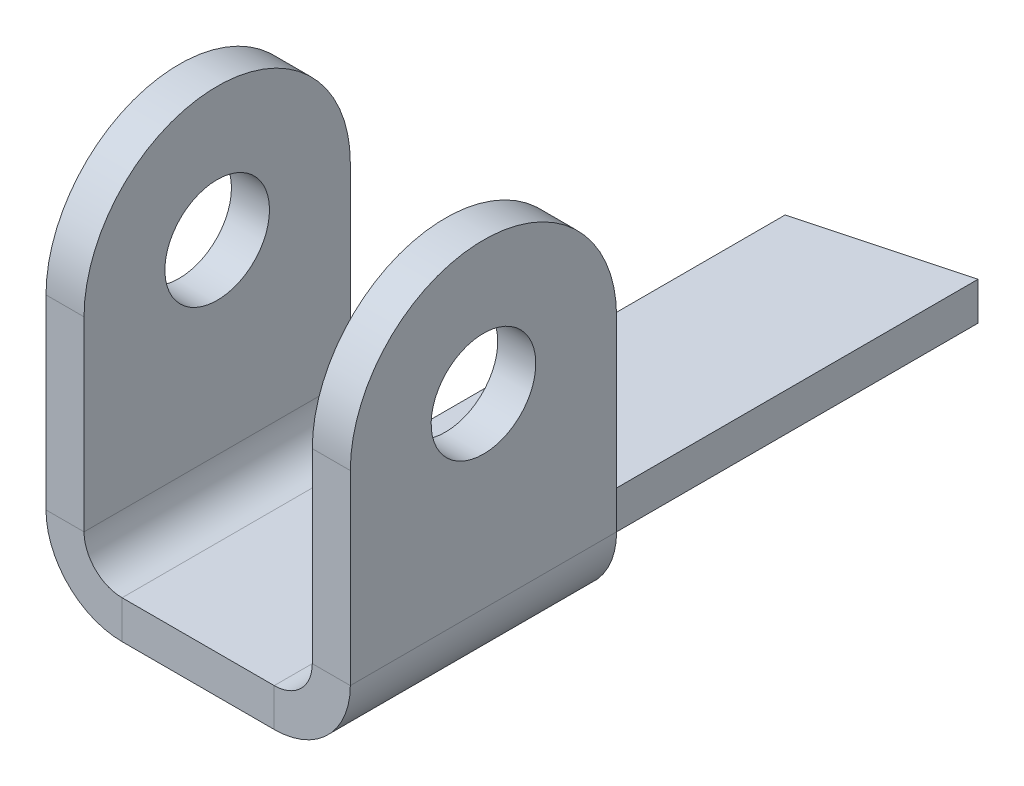
ISO-10303-21;
HEADER;
FILE_DESCRIPTION(('STEP AP214'),'2;1');
FILE_NAME('part.step','',(''),(''),'','','');
FILE_SCHEMA(('AUTOMOTIVE_DESIGN { 1 0 10303 214 1 1 1 1 }'));
ENDSEC;
DATA;
#1=APPLICATION_CONTEXT('core data for automotive mechanical design processes');
#2=APPLICATION_PROTOCOL_DEFINITION('international standard','automotive_design',2000,#1);
#3=PRODUCT_CONTEXT('',#1,'mechanical');
#4=PRODUCT('Part','Part','',(#3));
#5=PRODUCT_RELATED_PRODUCT_CATEGORY('part','',(#4));
#6=PRODUCT_DEFINITION_FORMATION('','',#4);
#7=PRODUCT_DEFINITION_CONTEXT('part definition',#1,'design');
#8=PRODUCT_DEFINITION('design','',#6,#7);
#9=PRODUCT_DEFINITION_SHAPE('','',#8);
#10=(LENGTH_UNIT() NAMED_UNIT(*) SI_UNIT(.MILLI.,.METRE.));
#11=(NAMED_UNIT(*) PLANE_ANGLE_UNIT() SI_UNIT($,.RADIAN.));
#12=(NAMED_UNIT(*) SI_UNIT($,.STERADIAN.) SOLID_ANGLE_UNIT());
#13=UNCERTAINTY_MEASURE_WITH_UNIT(LENGTH_MEASURE(1.E-05),#10,'distance_accuracy_value','');
#14=(GEOMETRIC_REPRESENTATION_CONTEXT(3) GLOBAL_UNCERTAINTY_ASSIGNED_CONTEXT((#13)) GLOBAL_UNIT_ASSIGNED_CONTEXT((#10,
#11,#12)) REPRESENTATION_CONTEXT('',''));
#15=CARTESIAN_POINT('',(0.,0.,0.));
#16=DIRECTION('',(0.,0.,1.));
#17=DIRECTION('',(1.,0.,0.));
#18=AXIS2_PLACEMENT_3D('',#15,#16,#17);
#19=CARTESIAN_POINT('',(-3.99999999999995,-2.,-18.5));
#20=DIRECTION('',(-1.,0.,0.));
#21=DIRECTION('',(0.,0.,-1.));
#22=AXIS2_PLACEMENT_3D('',#19,#20,#21);
#23=PLANE('',#22);
#24=DIRECTION('',(0.,0.,-1.));
#25=VECTOR('',#24,1.);
#26=CARTESIAN_POINT('',(-3.99999999999995,-2.,-18.5));
#27=LINE('',#26,#25);
#28=CARTESIAN_POINT('',(-4.,-2.,4.5));
#29=VERTEX_POINT('',#28);
#30=CARTESIAN_POINT('',(-4.,-2.,-16.3564064605511));
#31=VERTEX_POINT('',#30);
#32=EDGE_CURVE('E203',#29,#31,#27,.T.);
#33=ORIENTED_EDGE('',*,*,#32,.F.);
#34=DIRECTION('',(0.,-1.,0.));
#35=VECTOR('',#34,1.);
#36=CARTESIAN_POINT('',(-4.,0.,4.5));
#37=LINE('',#36,#35);
#38=CARTESIAN_POINT('',(-4.,0.,4.5));
#39=VERTEX_POINT('',#38);
#40=EDGE_CURVE('E177',#39,#29,#37,.T.);
#41=ORIENTED_EDGE('',*,*,#40,.F.);
#42=DIRECTION('',(0.,0.,-1.));
#43=VECTOR('',#42,1.);
#44=CARTESIAN_POINT('',(-3.99999999999995,0.,-18.5));
#45=LINE('',#44,#43);
#46=CARTESIAN_POINT('',(-4.,0.,-16.3564064605511));
#47=VERTEX_POINT('',#46);
#48=EDGE_CURVE('E159',#39,#47,#45,.T.);
#49=ORIENTED_EDGE('',*,*,#48,.T.);
#50=DIRECTION('',(0.,-1.,0.));
#51=VECTOR('',#50,1.);
#52=CARTESIAN_POINT('',(-4.,-2.,-16.3564064605511));
#53=LINE('',#52,#51);
#54=EDGE_CURVE('E165',#31,#47,#53,.F.);
#55=ORIENTED_EDGE('',*,*,#54,.F.);
#56=EDGE_LOOP('',(#33,#41,#49,#55));
#57=FACE_BOUND('',#56,.T.);
#58=ADVANCED_FACE('F47',(#57),#23,.T.);
#59=CARTESIAN_POINT('',(0.,-2.,0.));
#60=DIRECTION('',(0.,-1.,0.));
#61=DIRECTION('',(0.,0.,1.));
#62=AXIS2_PLACEMENT_3D('',#59,#60,#61);
#63=PLANE('',#62);
#64=DIRECTION('',(0.,0.,1.));
#65=VECTOR('',#64,1.);
#66=CARTESIAN_POINT('',(4.,-2.,-18.5));
#67=LINE('',#66,#65);
#68=CARTESIAN_POINT('',(4.,-2.,-18.5));
#69=VERTEX_POINT('',#68);
#70=CARTESIAN_POINT('',(4.00000000000003,-2.,4.50000000000003));
#71=VERTEX_POINT('',#70);
#72=EDGE_CURVE('E182',#69,#71,#67,.T.);
#73=ORIENTED_EDGE('',*,*,#72,.T.);
#74=DIRECTION('',(0.,0.,1.));
#75=VECTOR('',#74,1.);
#76=CARTESIAN_POINT('',(4.00000000000002,-2.,18.5));
#77=LINE('',#76,#75);
#78=CARTESIAN_POINT('',(4.00000000000002,-2.,18.5));
#79=VERTEX_POINT('',#78);
#80=EDGE_CURVE('E297',#79,#71,#77,.F.);
#81=ORIENTED_EDGE('',*,*,#80,.F.);
#82=DIRECTION('',(-1.,0.,0.));
#83=VECTOR('',#82,1.);
#84=CARTESIAN_POINT('',(-3.99999999999998,-2.,18.5));
#85=LINE('',#84,#83);
#86=CARTESIAN_POINT('',(-3.99999999999998,-2.,18.5));
#87=VERTEX_POINT('',#86);
#88=EDGE_CURVE('E207',#79,#87,#85,.T.);
#89=ORIENTED_EDGE('',*,*,#88,.T.);
#90=EDGE_CURVE('E199',#87,#29,#27,.T.);
#91=ORIENTED_EDGE('',*,*,#90,.T.);
#92=ORIENTED_EDGE('',*,*,#32,.T.);
#93=DIRECTION('',(-0.96592582628907,0.,0.258819045102514));
#94=VECTOR('',#93,1.);
#95=CARTESIAN_POINT('',(-4.35705080756876,-2.,-16.2607349850061));
#96=LINE('',#95,#94);
#97=EDGE_CURVE('E166',#69,#31,#96,.T.);
#98=ORIENTED_EDGE('',*,*,#97,.F.);
#99=EDGE_LOOP('',(#73,#81,#89,#91,#92,#98));
#100=FACE_BOUND('',#99,.T.);
#101=ADVANCED_FACE('F286',(#100),#63,.T.);
#102=CARTESIAN_POINT('',(0.,0.,0.));
#103=DIRECTION('',(0.,-1.,0.));
#104=DIRECTION('',(0.,0.,1.));
#105=AXIS2_PLACEMENT_3D('',#102,#103,#104);
#106=PLANE('',#105);
#107=DIRECTION('',(-0.96592582628907,0.,0.258819045102514));
#108=VECTOR('',#107,1.);
#109=CARTESIAN_POINT('',(-4.35705080756876,0.,-16.2607349850061));
#110=LINE('',#109,#108);
#111=CARTESIAN_POINT('',(4.,0.,-18.5));
#112=VERTEX_POINT('',#111);
#113=EDGE_CURVE('E154',#112,#47,#110,.T.);
#114=ORIENTED_EDGE('',*,*,#113,.T.);
#115=ORIENTED_EDGE('',*,*,#48,.F.);
#116=CARTESIAN_POINT('',(-3.99999999999998,0.,18.5));
#117=VERTEX_POINT('',#116);
#118=EDGE_CURVE('E178',#117,#39,#45,.T.);
#119=ORIENTED_EDGE('',*,*,#118,.F.);
#120=DIRECTION('',(-1.,0.,0.));
#121=VECTOR('',#120,1.);
#122=CARTESIAN_POINT('',(-3.99999999999998,0.,18.5));
#123=LINE('',#122,#121);
#124=CARTESIAN_POINT('',(4.00000000000002,0.,18.5));
#125=VERTEX_POINT('',#124);
#126=EDGE_CURVE('E179',#125,#117,#123,.T.);
#127=ORIENTED_EDGE('',*,*,#126,.F.);
#128=DIRECTION('',(0.,0.,1.));
#129=VECTOR('',#128,1.);
#130=CARTESIAN_POINT('',(4.00000000000002,0.,18.5));
#131=LINE('',#130,#129);
#132=CARTESIAN_POINT('',(4.00000000000003,0.,4.50000000000003));
#133=VERTEX_POINT('',#132);
#134=EDGE_CURVE('E310',#125,#133,#131,.F.);
#135=ORIENTED_EDGE('',*,*,#134,.T.);
#136=DIRECTION('',(0.,0.,1.));
#137=VECTOR('',#136,1.);
#138=CARTESIAN_POINT('',(4.,0.,-18.5));
#139=LINE('',#138,#137);
#140=EDGE_CURVE('E163',#112,#133,#139,.T.);
#141=ORIENTED_EDGE('',*,*,#140,.F.);
#142=EDGE_LOOP('',(#114,#115,#119,#127,#135,#141));
#143=FACE_BOUND('',#142,.T.);
#144=ADVANCED_FACE('F156',(#143),#106,.F.);
#145=CARTESIAN_POINT('',(4.,-2.,-18.5));
#146=DIRECTION('',(1.,0.,0.));
#147=DIRECTION('',(0.,0.,1.));
#148=AXIS2_PLACEMENT_3D('',#145,#146,#147);
#149=PLANE('',#148);
#150=DIRECTION('',(0.,-1.,0.));
#151=VECTOR('',#150,1.);
#152=CARTESIAN_POINT('',(4.00000000000003,0.,4.50000000000003));
#153=LINE('',#152,#151);
#154=EDGE_CURVE('E223',#133,#71,#153,.T.);
#155=ORIENTED_EDGE('',*,*,#154,.T.);
#156=ORIENTED_EDGE('',*,*,#72,.F.);
#157=DIRECTION('',(0.,1.,0.));
#158=VECTOR('',#157,1.);
#159=CARTESIAN_POINT('',(4.,-2.,-18.5));
#160=LINE('',#159,#158);
#161=EDGE_CURVE('E13',#69,#112,#160,.T.);
#162=ORIENTED_EDGE('',*,*,#161,.T.);
#163=ORIENTED_EDGE('',*,*,#140,.T.);
#164=EDGE_LOOP('',(#155,#156,#162,#163));
#165=FACE_BOUND('',#164,.T.);
#166=ADVANCED_FACE('F49',(#165),#149,.T.);
#167=CARTESIAN_POINT('',(-3.99999999999998,-2.,18.5));
#168=DIRECTION('',(0.,0.,1.));
#169=DIRECTION('',(-1.,0.,0.));
#170=AXIS2_PLACEMENT_3D('',#167,#168,#169);
#171=PLANE('',#170);
#172=ORIENTED_EDGE('',*,*,#126,.T.);
#173=DIRECTION('',(0.,1.,0.));
#174=VECTOR('',#173,1.);
#175=CARTESIAN_POINT('',(-3.99999999999998,-2.,18.5));
#176=LINE('',#175,#174);
#177=EDGE_CURVE('E56',#87,#117,#176,.T.);
#178=ORIENTED_EDGE('',*,*,#177,.F.);
#179=ORIENTED_EDGE('',*,*,#88,.F.);
#180=DIRECTION('',(0.,1.,0.));
#181=VECTOR('',#180,1.);
#182=CARTESIAN_POINT('',(4.00000000000002,-2.,18.5));
#183=LINE('',#182,#181);
#184=EDGE_CURVE('E188',#79,#125,#183,.T.);
#185=ORIENTED_EDGE('',*,*,#184,.T.);
#186=EDGE_LOOP('',(#172,#178,#179,#185));
#187=FACE_BOUND('',#186,.T.);
#188=ADVANCED_FACE('F367',(#187),#171,.T.);
#189=CARTESIAN_POINT('',(-3.99999999999998,2.,18.5));
#190=DIRECTION('',(0.,0.,1.));
#191=DIRECTION('',(-1.,0.,0.));
#192=AXIS2_PLACEMENT_3D('',#189,#190,#191);
#193=PLANE('',#192);
#194=DIRECTION('',(1.,0.,0.));
#195=VECTOR('',#194,1.);
#196=CARTESIAN_POINT('',(-7.99999999999998,1.99999999999997,18.5));
#197=LINE('',#196,#195);
#198=CARTESIAN_POINT('',(-5.99999999999998,2.,18.5));
#199=VERTEX_POINT('',#198);
#200=CARTESIAN_POINT('',(-7.99999999999998,1.99999999999997,18.5));
#201=VERTEX_POINT('',#200);
#202=EDGE_CURVE('E271',#199,#201,#197,.F.);
#203=ORIENTED_EDGE('',*,*,#202,.T.);
#204=CARTESIAN_POINT('',(-3.99999999999998,2.,18.5));
#205=DIRECTION('',(0.,0.,1.));
#206=DIRECTION('',(1.,0.,0.));
#207=AXIS2_PLACEMENT_3D('',#204,#205,#206);
#208=CIRCLE('',#207,4.);
#209=EDGE_CURVE('E233',#87,#201,#208,.F.);
#210=ORIENTED_EDGE('',*,*,#209,.F.);
#211=ORIENTED_EDGE('',*,*,#177,.T.);
#212=CARTESIAN_POINT('',(-3.99999999999998,2.,18.5));
#213=DIRECTION('',(0.,0.,1.));
#214=DIRECTION('',(1.,0.,0.));
#215=AXIS2_PLACEMENT_3D('',#212,#213,#214);
#216=CIRCLE('',#215,2.);
#217=EDGE_CURVE('E230',#117,#199,#216,.F.);
#218=ORIENTED_EDGE('',*,*,#217,.T.);
#219=EDGE_LOOP('',(#203,#210,#211,#218));
#220=FACE_BOUND('',#219,.T.);
#221=ADVANCED_FACE('F276',(#220),#193,.T.);
#222=CARTESIAN_POINT('',(-4.,2.,4.5));
#223=DIRECTION('',(0.,0.,1.));
#224=DIRECTION('',(-1.,0.,0.));
#225=AXIS2_PLACEMENT_3D('',#222,#223,#224);
#226=PLANE('',#225);
#227=CARTESIAN_POINT('',(-4.,2.,4.5));
#228=DIRECTION('',(0.,0.,1.));
#229=DIRECTION('',(1.,0.,0.));
#230=AXIS2_PLACEMENT_3D('',#227,#228,#229);
#231=CIRCLE('',#230,2.);
#232=CARTESIAN_POINT('',(-5.99999999999996,2.,4.50000000000003));
#233=VERTEX_POINT('',#232);
#234=EDGE_CURVE('E235',#233,#39,#231,.T.);
#235=ORIENTED_EDGE('',*,*,#234,.T.);
#236=ORIENTED_EDGE('',*,*,#40,.T.);
#237=CARTESIAN_POINT('',(-4.,2.,4.5));
#238=DIRECTION('',(0.,0.,1.));
#239=DIRECTION('',(1.,0.,0.));
#240=AXIS2_PLACEMENT_3D('',#237,#238,#239);
#241=CIRCLE('',#240,4.);
#242=CARTESIAN_POINT('',(-7.99999999999997,1.99999999999997,4.5));
#243=VERTEX_POINT('',#242);
#244=EDGE_CURVE('E72',#243,#29,#241,.T.);
#245=ORIENTED_EDGE('',*,*,#244,.F.);
#246=DIRECTION('',(1.,0.,0.));
#247=VECTOR('',#246,1.);
#248=CARTESIAN_POINT('',(-5.99999999999996,2.,4.50000000000003));
#249=LINE('',#248,#247);
#250=EDGE_CURVE('E265',#233,#243,#249,.F.);
#251=ORIENTED_EDGE('',*,*,#250,.F.);
#252=EDGE_LOOP('',(#235,#236,#245,#251));
#253=FACE_BOUND('',#252,.T.);
#254=ADVANCED_FACE('F285',(#253),#226,.F.);
#255=CARTESIAN_POINT('',(-4.,2.,4.5));
#256=DIRECTION('',(0.,0.,-1.));
#257=DIRECTION('',(-1.,0.,0.));
#258=AXIS2_PLACEMENT_3D('',#255,#256,#257);
#259=CYLINDRICAL_SURFACE('',#258,4.);
#260=ORIENTED_EDGE('',*,*,#90,.F.);
#261=ORIENTED_EDGE('',*,*,#209,.T.);
#262=DIRECTION('',(0.,0.,-1.));
#263=VECTOR('',#262,1.);
#264=CARTESIAN_POINT('',(-7.99999999999998,1.99999999999997,18.5));
#265=LINE('',#264,#263);
#266=EDGE_CURVE('E262',#243,#201,#265,.F.);
#267=ORIENTED_EDGE('',*,*,#266,.F.);
#268=ORIENTED_EDGE('',*,*,#244,.T.);
#269=EDGE_LOOP('',(#260,#261,#267,#268));
#270=FACE_BOUND('',#269,.T.);
#271=ADVANCED_FACE('F274',(#270),#259,.T.);
#272=CARTESIAN_POINT('',(-4.,2.,4.5));
#273=DIRECTION('',(0.,0.,-1.));
#274=DIRECTION('',(-1.,0.,0.));
#275=AXIS2_PLACEMENT_3D('',#272,#273,#274);
#276=CYLINDRICAL_SURFACE('',#275,2.);
#277=ORIENTED_EDGE('',*,*,#118,.T.);
#278=ORIENTED_EDGE('',*,*,#234,.F.);
#279=DIRECTION('',(0.,0.,-1.));
#280=VECTOR('',#279,1.);
#281=CARTESIAN_POINT('',(-5.99999999999998,2.,18.5));
#282=LINE('',#281,#280);
#283=EDGE_CURVE('E268',#199,#233,#282,.T.);
#284=ORIENTED_EDGE('',*,*,#283,.F.);
#285=ORIENTED_EDGE('',*,*,#217,.F.);
#286=EDGE_LOOP('',(#277,#278,#284,#285));
#287=FACE_BOUND('',#286,.T.);
#288=ADVANCED_FACE('F370',(#287),#276,.F.);
#289=CARTESIAN_POINT('',(-8.00000000000002,11.79,4.50000000000003));
#290=DIRECTION('',(0.,0.,1.));
#291=DIRECTION('',(0.,1.,0.));
#292=AXIS2_PLACEMENT_3D('',#289,#290,#291);
#293=PLANE('',#292);
#294=ORIENTED_EDGE('',*,*,#250,.T.);
#295=DIRECTION('',(0.,1.,0.));
#296=VECTOR('',#295,1.);
#297=CARTESIAN_POINT('',(-8.00000000000002,11.79,4.50000000000003));
#298=LINE('',#297,#296);
#299=CARTESIAN_POINT('',(-8.00000000000002,11.79,4.50000000000003));
#300=VERTEX_POINT('',#299);
#301=EDGE_CURVE('E253',#243,#300,#298,.T.);
#302=ORIENTED_EDGE('',*,*,#301,.T.);
#303=DIRECTION('',(1.,0.,0.));
#304=VECTOR('',#303,1.);
#305=CARTESIAN_POINT('',(-8.00000000000002,11.79,4.50000000000003));
#306=LINE('',#305,#304);
#307=CARTESIAN_POINT('',(-6.00000000000001,11.79,4.50000000000003));
#308=VERTEX_POINT('',#307);
#309=EDGE_CURVE('E236',#300,#308,#306,.T.);
#310=ORIENTED_EDGE('',*,*,#309,.T.);
#311=DIRECTION('',(0.,-1.,0.));
#312=VECTOR('',#311,1.);
#313=CARTESIAN_POINT('',(-6.00000000000001,11.79,4.50000000000003));
#314=LINE('',#313,#312);
#315=EDGE_CURVE('E259',#233,#308,#314,.F.);
#316=ORIENTED_EDGE('',*,*,#315,.F.);
#317=EDGE_LOOP('',(#294,#302,#310,#316));
#318=FACE_BOUND('',#317,.T.);
#319=ADVANCED_FACE('F284',(#318),#293,.F.);
#320=CARTESIAN_POINT('',(-7.99999999999998,0.,18.5));
#321=DIRECTION('',(0.,0.,-1.));
#322=DIRECTION('',(1.,0.,0.));
#323=AXIS2_PLACEMENT_3D('',#320,#321,#322);
#324=PLANE('',#323);
#325=ORIENTED_EDGE('',*,*,#202,.F.);
#326=DIRECTION('',(0.,1.,0.));
#327=VECTOR('',#326,1.);
#328=CARTESIAN_POINT('',(-5.99999999999996,0.,18.5));
#329=LINE('',#328,#327);
#330=CARTESIAN_POINT('',(-5.99999999999999,11.79,18.5));
#331=VERTEX_POINT('',#330);
#332=EDGE_CURVE('E255',#331,#199,#329,.F.);
#333=ORIENTED_EDGE('',*,*,#332,.F.);
#334=DIRECTION('',(1.,0.,0.));
#335=VECTOR('',#334,1.);
#336=CARTESIAN_POINT('',(-7.99999999999999,11.79,18.5));
#337=LINE('',#336,#335);
#338=CARTESIAN_POINT('',(-7.99999999999999,11.79,18.5));
#339=VERTEX_POINT('',#338);
#340=EDGE_CURVE('E241',#339,#331,#337,.T.);
#341=ORIENTED_EDGE('',*,*,#340,.F.);
#342=DIRECTION('',(0.,-1.,0.));
#343=VECTOR('',#342,1.);
#344=CARTESIAN_POINT('',(-7.99999999999999,11.79,18.5));
#345=LINE('',#344,#343);
#346=EDGE_CURVE('E247',#339,#201,#345,.T.);
#347=ORIENTED_EDGE('',*,*,#346,.T.);
#348=EDGE_LOOP('',(#325,#333,#341,#347));
#349=FACE_BOUND('',#348,.T.);
#350=ADVANCED_FACE('F279',(#349),#324,.F.);
#351=CARTESIAN_POINT('',(-7.99999999999999,11.79,11.5));
#352=DIRECTION('',(1.,0.,0.));
#353=DIRECTION('',(0.,1.,0.));
#354=AXIS2_PLACEMENT_3D('',#351,#352,#353);
#355=PLANE('',#354);
#356=CARTESIAN_POINT('',(-7.99999999999999,11.79,11.5));
#357=DIRECTION('',(1.,0.,0.));
#358=DIRECTION('',(0.,0.,-1.));
#359=AXIS2_PLACEMENT_3D('',#356,#357,#358);
#360=CIRCLE('',#359,2.74999999999999);
#361=CARTESIAN_POINT('',(-7.99999999999999,11.79,8.75000000000005));
#362=VERTEX_POINT('',#361);
#363=EDGE_CURVE('E174',#362,#362,#360,.T.);
#364=ORIENTED_EDGE('',*,*,#363,.T.);
#365=EDGE_LOOP('',(#364));
#366=FACE_BOUND('',#365,.T.);
#367=ORIENTED_EDGE('',*,*,#266,.T.);
#368=ORIENTED_EDGE('',*,*,#346,.F.);
#369=CARTESIAN_POINT('',(-7.99999999999999,11.79,11.5));
#370=DIRECTION('',(-1.,0.,0.));
#371=DIRECTION('',(0.,1.,0.));
#372=AXIS2_PLACEMENT_3D('',#369,#370,#371);
#373=CIRCLE('',#372,7.);
#374=EDGE_CURVE('E251',#300,#339,#373,.F.);
#375=ORIENTED_EDGE('',*,*,#374,.F.);
#376=ORIENTED_EDGE('',*,*,#301,.F.);
#377=EDGE_LOOP('',(#367,#368,#375,#376));
#378=FACE_BOUND('',#377,.T.);
#379=ADVANCED_FACE('F283',(#366,#378),#355,.F.);
#380=CARTESIAN_POINT('',(-5.99999999999999,11.79,11.5));
#381=DIRECTION('',(1.,0.,0.));
#382=DIRECTION('',(0.,1.,0.));
#383=AXIS2_PLACEMENT_3D('',#380,#381,#382);
#384=PLANE('',#383);
#385=CARTESIAN_POINT('',(-5.99999999999999,11.79,11.5));
#386=DIRECTION('',(-1.,0.,0.));
#387=DIRECTION('',(0.,1.,0.));
#388=AXIS2_PLACEMENT_3D('',#385,#386,#387);
#389=CIRCLE('',#388,2.74999999999999);
#390=CARTESIAN_POINT('',(-6.,14.54,11.5));
#391=VERTEX_POINT('',#390);
#392=EDGE_CURVE('E328',#391,#391,#389,.T.);
#393=ORIENTED_EDGE('',*,*,#392,.T.);
#394=EDGE_LOOP('',(#393));
#395=FACE_BOUND('',#394,.T.);
#396=ORIENTED_EDGE('',*,*,#315,.T.);
#397=CARTESIAN_POINT('',(-5.99999999999999,11.79,11.5));
#398=DIRECTION('',(-1.,0.,0.));
#399=DIRECTION('',(0.,1.,0.));
#400=AXIS2_PLACEMENT_3D('',#397,#398,#399);
#401=CIRCLE('',#400,7.);
#402=EDGE_CURVE('E257',#308,#331,#401,.F.);
#403=ORIENTED_EDGE('',*,*,#402,.T.);
#404=ORIENTED_EDGE('',*,*,#332,.T.);
#405=ORIENTED_EDGE('',*,*,#283,.T.);
#406=EDGE_LOOP('',(#396,#403,#404,#405));
#407=FACE_BOUND('',#406,.T.);
#408=ADVANCED_FACE('F373',(#395,#407),#384,.T.);
#409=CARTESIAN_POINT('',(-7.99999999999999,11.79,11.5));
#410=DIRECTION('',(1.,0.,0.));
#411=DIRECTION('',(0.,1.,0.));
#412=AXIS2_PLACEMENT_3D('',#409,#410,#411);
#413=CYLINDRICAL_SURFACE('',#412,7.);
#414=ORIENTED_EDGE('',*,*,#402,.F.);
#415=ORIENTED_EDGE('',*,*,#309,.F.);
#416=ORIENTED_EDGE('',*,*,#374,.T.);
#417=ORIENTED_EDGE('',*,*,#340,.T.);
#418=EDGE_LOOP('',(#414,#415,#416,#417));
#419=FACE_BOUND('',#418,.T.);
#420=ADVANCED_FACE('F375',(#419),#413,.T.);
#421=CARTESIAN_POINT('',(4.00000000000003,2.,4.50000000000003));
#422=DIRECTION('',(0.,0.,-1.));
#423=DIRECTION('',(1.,0.,0.));
#424=AXIS2_PLACEMENT_3D('',#421,#422,#423);
#425=PLANE('',#424);
#426=DIRECTION('',(1.,0.,0.));
#427=VECTOR('',#426,1.);
#428=CARTESIAN_POINT('',(8.00000000000004,1.99999999999997,4.5));
#429=LINE('',#428,#427);
#430=CARTESIAN_POINT('',(6.00000000000003,2.,4.5));
#431=VERTEX_POINT('',#430);
#432=CARTESIAN_POINT('',(8.00000000000004,1.99999999999997,4.5));
#433=VERTEX_POINT('',#432);
#434=EDGE_CURVE('E318',#431,#433,#429,.T.);
#435=ORIENTED_EDGE('',*,*,#434,.T.);
#436=CARTESIAN_POINT('',(4.00000000000003,2.,4.50000000000003));
#437=DIRECTION('',(0.,0.,-1.));
#438=DIRECTION('',(-1.,0.,0.));
#439=AXIS2_PLACEMENT_3D('',#436,#437,#438);
#440=CIRCLE('',#439,4.);
#441=EDGE_CURVE('E294',#71,#433,#440,.F.);
#442=ORIENTED_EDGE('',*,*,#441,.F.);
#443=ORIENTED_EDGE('',*,*,#154,.F.);
#444=CARTESIAN_POINT('',(4.00000000000003,2.,4.50000000000003));
#445=DIRECTION('',(0.,0.,-1.));
#446=DIRECTION('',(-1.,0.,0.));
#447=AXIS2_PLACEMENT_3D('',#444,#445,#446);
#448=CIRCLE('',#447,2.);
#449=EDGE_CURVE('E64',#133,#431,#448,.F.);
#450=ORIENTED_EDGE('',*,*,#449,.T.);
#451=EDGE_LOOP('',(#435,#442,#443,#450));
#452=FACE_BOUND('',#451,.T.);
#453=ADVANCED_FACE('F317',(#452),#425,.T.);
#454=CARTESIAN_POINT('',(4.00000000000002,2.,18.5));
#455=DIRECTION('',(0.,0.,-1.));
#456=DIRECTION('',(1.,0.,0.));
#457=AXIS2_PLACEMENT_3D('',#454,#455,#456);
#458=PLANE('',#457);
#459=CARTESIAN_POINT('',(4.00000000000002,2.,18.5));
#460=DIRECTION('',(0.,0.,-1.));
#461=DIRECTION('',(-1.,0.,0.));
#462=AXIS2_PLACEMENT_3D('',#459,#460,#461);
#463=CIRCLE('',#462,2.);
#464=CARTESIAN_POINT('',(6.00000000000003,2.,18.5));
#465=VERTEX_POINT('',#464);
#466=EDGE_CURVE('E312',#465,#125,#463,.T.);
#467=ORIENTED_EDGE('',*,*,#466,.T.);
#468=ORIENTED_EDGE('',*,*,#184,.F.);
#469=CARTESIAN_POINT('',(4.00000000000002,2.,18.5));
#470=DIRECTION('',(0.,0.,-1.));
#471=DIRECTION('',(-1.,0.,0.));
#472=AXIS2_PLACEMENT_3D('',#469,#470,#471);
#473=CIRCLE('',#472,4.);
#474=CARTESIAN_POINT('',(8.00000000000001,1.99999999999997,18.5));
#475=VERTEX_POINT('',#474);
#476=EDGE_CURVE('E302',#475,#79,#473,.T.);
#477=ORIENTED_EDGE('',*,*,#476,.F.);
#478=DIRECTION('',(1.,0.,0.));
#479=VECTOR('',#478,1.);
#480=CARTESIAN_POINT('',(6.00000000000003,2.,18.5));
#481=LINE('',#480,#479);
#482=EDGE_CURVE('E331',#465,#475,#481,.T.);
#483=ORIENTED_EDGE('',*,*,#482,.F.);
#484=EDGE_LOOP('',(#467,#468,#477,#483));
#485=FACE_BOUND('',#484,.T.);
#486=ADVANCED_FACE('F366',(#485),#458,.F.);
#487=CARTESIAN_POINT('',(4.00000000000002,2.,18.5));
#488=DIRECTION('',(0.,0.,1.));
#489=DIRECTION('',(1.,0.,0.));
#490=AXIS2_PLACEMENT_3D('',#487,#488,#489);
#491=CYLINDRICAL_SURFACE('',#490,4.);
#492=ORIENTED_EDGE('',*,*,#80,.T.);
#493=ORIENTED_EDGE('',*,*,#441,.T.);
#494=DIRECTION('',(0.,0.,1.));
#495=VECTOR('',#494,1.);
#496=CARTESIAN_POINT('',(8.00000000000004,1.99999999999997,4.5));
#497=LINE('',#496,#495);
#498=EDGE_CURVE('E362',#475,#433,#497,.F.);
#499=ORIENTED_EDGE('',*,*,#498,.F.);
#500=ORIENTED_EDGE('',*,*,#476,.T.);
#501=EDGE_LOOP('',(#492,#493,#499,#500));
#502=FACE_BOUND('',#501,.T.);
#503=ADVANCED_FACE('F298',(#502),#491,.T.);
#504=CARTESIAN_POINT('',(4.00000000000002,2.,18.5));
#505=DIRECTION('',(0.,0.,1.));
#506=DIRECTION('',(1.,0.,0.));
#507=AXIS2_PLACEMENT_3D('',#504,#505,#506);
#508=CYLINDRICAL_SURFACE('',#507,2.);
#509=ORIENTED_EDGE('',*,*,#134,.F.);
#510=ORIENTED_EDGE('',*,*,#466,.F.);
#511=DIRECTION('',(0.,0.,1.));
#512=VECTOR('',#511,1.);
#513=CARTESIAN_POINT('',(6.00000000000003,2.,4.5));
#514=LINE('',#513,#512);
#515=EDGE_CURVE('E327',#431,#465,#514,.T.);
#516=ORIENTED_EDGE('',*,*,#515,.F.);
#517=ORIENTED_EDGE('',*,*,#449,.F.);
#518=EDGE_LOOP('',(#509,#510,#516,#517));
#519=FACE_BOUND('',#518,.T.);
#520=ADVANCED_FACE('F482',(#519),#508,.F.);
#521=CARTESIAN_POINT('',(8.00000000000001,0.,18.5));
#522=DIRECTION('',(0.,0.,1.));
#523=DIRECTION('',(-1.,0.,0.));
#524=AXIS2_PLACEMENT_3D('',#521,#522,#523);
#525=PLANE('',#524);
#526=DIRECTION('',(0.,1.,0.));
#527=VECTOR('',#526,1.);
#528=CARTESIAN_POINT('',(8.00000000000001,0.,18.5));
#529=LINE('',#528,#527);
#530=CARTESIAN_POINT('',(8.00000000000006,11.79,18.5));
#531=VERTEX_POINT('',#530);
#532=EDGE_CURVE('E355',#531,#475,#529,.F.);
#533=ORIENTED_EDGE('',*,*,#532,.F.);
#534=DIRECTION('',(-1.,0.,0.));
#535=VECTOR('',#534,1.);
#536=CARTESIAN_POINT('',(8.00000000000006,11.79,18.5));
#537=LINE('',#536,#535);
#538=CARTESIAN_POINT('',(6.00000000000007,11.79,18.5));
#539=VERTEX_POINT('',#538);
#540=EDGE_CURVE('E338',#531,#539,#537,.T.);
#541=ORIENTED_EDGE('',*,*,#540,.T.);
#542=DIRECTION('',(0.,-1.,0.));
#543=VECTOR('',#542,1.);
#544=CARTESIAN_POINT('',(6.00000000000007,11.79,18.5));
#545=LINE('',#544,#543);
#546=EDGE_CURVE('E360',#539,#465,#545,.T.);
#547=ORIENTED_EDGE('',*,*,#546,.T.);
#548=ORIENTED_EDGE('',*,*,#482,.T.);
#549=EDGE_LOOP('',(#533,#541,#547,#548));
#550=FACE_BOUND('',#549,.T.);
#551=ADVANCED_FACE('F364',(#550),#525,.T.);
#552=CARTESIAN_POINT('',(8.00000000000008,11.79,4.5));
#553=DIRECTION('',(0.,0.,-1.));
#554=DIRECTION('',(0.,-1.,0.));
#555=AXIS2_PLACEMENT_3D('',#552,#553,#554);
#556=PLANE('',#555);
#557=DIRECTION('',(0.,1.,0.));
#558=VECTOR('',#557,1.);
#559=CARTESIAN_POINT('',(6.00000000000003,11.79,4.5));
#560=LINE('',#559,#558);
#561=CARTESIAN_POINT('',(6.00000000000003,11.79,4.5));
#562=VERTEX_POINT('',#561);
#563=EDGE_CURVE('E323',#431,#562,#560,.T.);
#564=ORIENTED_EDGE('',*,*,#563,.T.);
#565=DIRECTION('',(-1.,0.,0.));
#566=VECTOR('',#565,1.);
#567=CARTESIAN_POINT('',(8.00000000000008,11.79,4.5));
#568=LINE('',#567,#566);
#569=CARTESIAN_POINT('',(8.00000000000008,11.79,4.5));
#570=VERTEX_POINT('',#569);
#571=EDGE_CURVE('E344',#570,#562,#568,.T.);
#572=ORIENTED_EDGE('',*,*,#571,.F.);
#573=DIRECTION('',(0.,-1.,0.));
#574=VECTOR('',#573,1.);
#575=CARTESIAN_POINT('',(8.00000000000008,11.79,4.5));
#576=LINE('',#575,#574);
#577=EDGE_CURVE('E325',#433,#570,#576,.F.);
#578=ORIENTED_EDGE('',*,*,#577,.F.);
#579=ORIENTED_EDGE('',*,*,#434,.F.);
#580=EDGE_LOOP('',(#564,#572,#578,#579));
#581=FACE_BOUND('',#580,.T.);
#582=ADVANCED_FACE('F321',(#581),#556,.T.);
#583=CARTESIAN_POINT('',(8.00000000000008,11.79,11.5));
#584=DIRECTION('',(-1.,0.,0.));
#585=DIRECTION('',(0.,1.,0.));
#586=AXIS2_PLACEMENT_3D('',#583,#584,#585);
#587=PLANE('',#586);
#588=CARTESIAN_POINT('',(8.00000000000008,11.79,11.5));
#589=DIRECTION('',(1.,0.,0.));
#590=DIRECTION('',(0.,-1.,0.));
#591=AXIS2_PLACEMENT_3D('',#588,#589,#590);
#592=CIRCLE('',#591,2.74999999999999);
#593=CARTESIAN_POINT('',(8.00000000000007,9.04,11.5));
#594=VERTEX_POINT('',#593);
#595=EDGE_CURVE('E334',#594,#594,#592,.T.);
#596=ORIENTED_EDGE('',*,*,#595,.F.);
#597=EDGE_LOOP('',(#596));
#598=FACE_BOUND('',#597,.T.);
#599=ORIENTED_EDGE('',*,*,#498,.T.);
#600=ORIENTED_EDGE('',*,*,#577,.T.);
#601=CARTESIAN_POINT('',(8.00000000000008,11.79,11.5));
#602=DIRECTION('',(1.,0.,0.));
#603=DIRECTION('',(0.,-1.,0.));
#604=AXIS2_PLACEMENT_3D('',#601,#602,#603);
#605=CIRCLE('',#604,7.);
#606=EDGE_CURVE('E353',#570,#531,#605,.T.);
#607=ORIENTED_EDGE('',*,*,#606,.T.);
#608=ORIENTED_EDGE('',*,*,#532,.T.);
#609=EDGE_LOOP('',(#599,#600,#607,#608));
#610=FACE_BOUND('',#609,.T.);
#611=ADVANCED_FACE('F508',(#598,#610),#587,.F.);
#612=CARTESIAN_POINT('',(6.00000000000007,11.79,11.5));
#613=DIRECTION('',(-1.,0.,0.));
#614=DIRECTION('',(0.,1.,0.));
#615=AXIS2_PLACEMENT_3D('',#612,#613,#614);
#616=PLANE('',#615);
#617=CARTESIAN_POINT('',(6.00000000000007,11.79,11.5));
#618=DIRECTION('',(1.,0.,0.));
#619=DIRECTION('',(0.,-1.,0.));
#620=AXIS2_PLACEMENT_3D('',#617,#618,#619);
#621=CIRCLE('',#620,2.74999999999999);
#622=CARTESIAN_POINT('',(6.00000000000006,9.04,11.5));
#623=VERTEX_POINT('',#622);
#624=EDGE_CURVE('E51',#623,#623,#621,.T.);
#625=ORIENTED_EDGE('',*,*,#624,.T.);
#626=EDGE_LOOP('',(#625));
#627=FACE_BOUND('',#626,.T.);
#628=ORIENTED_EDGE('',*,*,#546,.F.);
#629=CARTESIAN_POINT('',(6.00000000000007,11.79,11.5));
#630=DIRECTION('',(1.,0.,0.));
#631=DIRECTION('',(0.,-1.,0.));
#632=AXIS2_PLACEMENT_3D('',#629,#630,#631);
#633=CIRCLE('',#632,7.);
#634=EDGE_CURVE('E358',#562,#539,#633,.T.);
#635=ORIENTED_EDGE('',*,*,#634,.F.);
#636=ORIENTED_EDGE('',*,*,#563,.F.);
#637=ORIENTED_EDGE('',*,*,#515,.T.);
#638=EDGE_LOOP('',(#628,#635,#636,#637));
#639=FACE_BOUND('',#638,.T.);
#640=ADVANCED_FACE('F516',(#627,#639),#616,.T.);
#641=CARTESIAN_POINT('',(8.00000000000008,11.79,11.5));
#642=DIRECTION('',(-1.,0.,0.));
#643=DIRECTION('',(0.,-1.,0.));
#644=AXIS2_PLACEMENT_3D('',#641,#642,#643);
#645=CYLINDRICAL_SURFACE('',#644,7.);
#646=ORIENTED_EDGE('',*,*,#634,.T.);
#647=ORIENTED_EDGE('',*,*,#540,.F.);
#648=ORIENTED_EDGE('',*,*,#606,.F.);
#649=ORIENTED_EDGE('',*,*,#571,.T.);
#650=EDGE_LOOP('',(#646,#647,#648,#649));
#651=FACE_BOUND('',#650,.T.);
#652=ADVANCED_FACE('F526',(#651),#645,.T.);
#653=CARTESIAN_POINT('',(-7.99999999999999,11.79,11.5));
#654=DIRECTION('',(-1.,0.,0.));
#655=DIRECTION('',(0.,0.,-1.));
#656=AXIS2_PLACEMENT_3D('',#653,#654,#655);
#657=CYLINDRICAL_SURFACE('',#656,2.74999999999999);
#658=ORIENTED_EDGE('',*,*,#624,.F.);
#659=EDGE_LOOP('',(#658));
#660=FACE_BOUND('',#659,.T.);
#661=ORIENTED_EDGE('',*,*,#595,.T.);
#662=EDGE_LOOP('',(#661));
#663=FACE_BOUND('',#662,.T.);
#664=ADVANCED_FACE('F536',(#660,#663),#657,.F.);
#665=ORIENTED_EDGE('',*,*,#392,.F.);
#666=EDGE_LOOP('',(#665));
#667=FACE_BOUND('',#666,.T.);
#668=ORIENTED_EDGE('',*,*,#363,.F.);
#669=EDGE_LOOP('',(#668));
#670=FACE_BOUND('',#669,.T.);
#671=ADVANCED_FACE('F546',(#667,#670),#657,.F.);
#672=CARTESIAN_POINT('',(-4.35705080756876,-2.,-16.2607349850061));
#673=DIRECTION('',(-0.258819045102514,0.,-0.96592582628907));
#674=DIRECTION('',(-0.96592582628907,0.,0.258819045102514));
#675=AXIS2_PLACEMENT_3D('',#672,#673,#674);
#676=PLANE('',#675);
#677=ORIENTED_EDGE('',*,*,#54,.T.);
#678=ORIENTED_EDGE('',*,*,#113,.F.);
#679=ORIENTED_EDGE('',*,*,#161,.F.);
#680=ORIENTED_EDGE('',*,*,#97,.T.);
#681=EDGE_LOOP('',(#677,#678,#679,#680));
#682=FACE_BOUND('',#681,.T.);
#683=ADVANCED_FACE('F169',(#682),#676,.T.);
#684=CLOSED_SHELL('',(#58,#101,#144,#166,#188,#221,#254,#271,#288,#319,#350,#379,#408,#420,#453,
#486,#503,#520,#551,#582,#611,#640,#652,#664,#671,#683));
#685=MANIFOLD_SOLID_BREP('B2',#684);
#686=ADVANCED_BREP_SHAPE_REPRESENTATION('',(#18,#685),#14);
#687=SHAPE_DEFINITION_REPRESENTATION(#9,#686);
ENDSEC;
END-ISO-10303-21;
